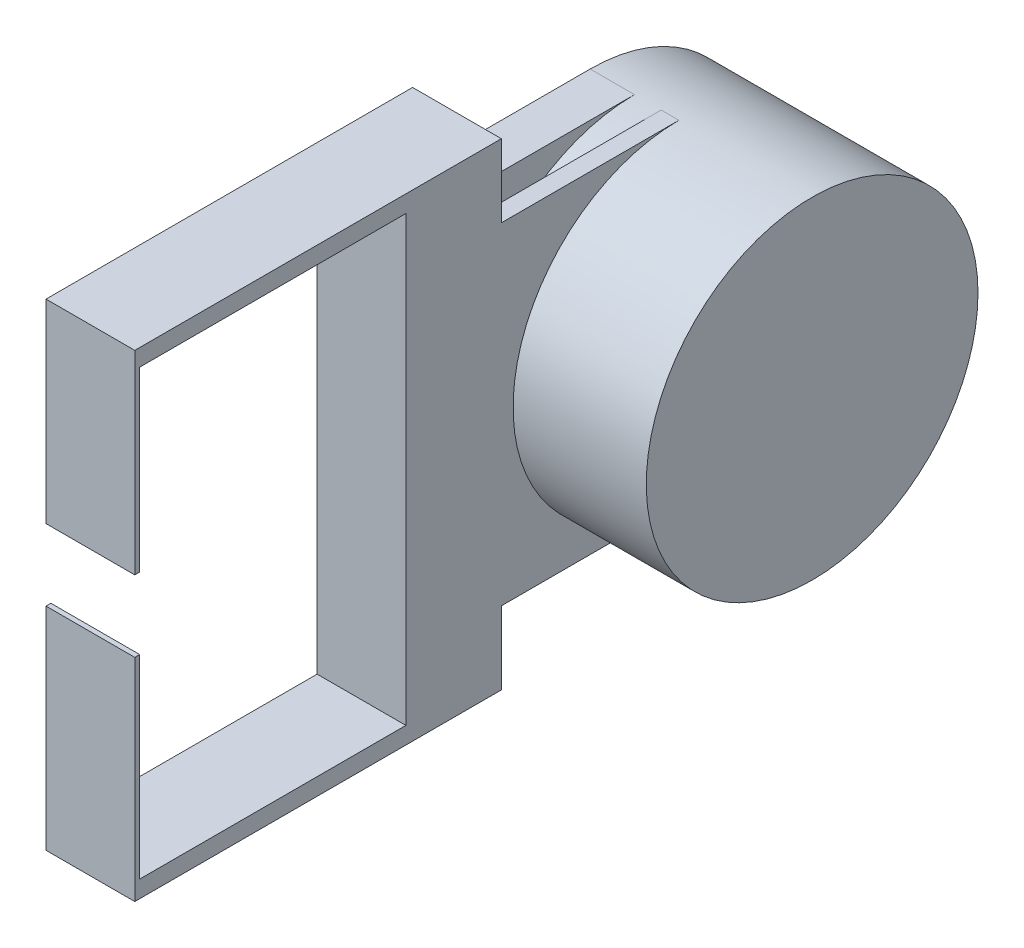
ISO-10303-21;
HEADER;
FILE_DESCRIPTION(('STEP AP214'),'2;1');
FILE_NAME('part.step','',(''),(''),'','','');
FILE_SCHEMA(('AUTOMOTIVE_DESIGN { 1 0 10303 214 1 1 1 1 }'));
ENDSEC;
DATA;
#1=APPLICATION_CONTEXT('core data for automotive mechanical design processes');
#2=APPLICATION_PROTOCOL_DEFINITION('international standard','automotive_design',2000,#1);
#3=PRODUCT_CONTEXT('',#1,'mechanical');
#4=PRODUCT('Part','Part','',(#3));
#5=PRODUCT_RELATED_PRODUCT_CATEGORY('part','',(#4));
#6=PRODUCT_DEFINITION_FORMATION('','',#4);
#7=PRODUCT_DEFINITION_CONTEXT('part definition',#1,'design');
#8=PRODUCT_DEFINITION('design','',#6,#7);
#9=PRODUCT_DEFINITION_SHAPE('','',#8);
#10=(LENGTH_UNIT() NAMED_UNIT(*) SI_UNIT(.MILLI.,.METRE.));
#11=(NAMED_UNIT(*) PLANE_ANGLE_UNIT() SI_UNIT($,.RADIAN.));
#12=(NAMED_UNIT(*) SI_UNIT($,.STERADIAN.) SOLID_ANGLE_UNIT());
#13=UNCERTAINTY_MEASURE_WITH_UNIT(LENGTH_MEASURE(1.E-05),#10,'distance_accuracy_value','');
#14=(GEOMETRIC_REPRESENTATION_CONTEXT(3) GLOBAL_UNCERTAINTY_ASSIGNED_CONTEXT((#13)) GLOBAL_UNIT_ASSIGNED_CONTEXT((#10,
#11,#12)) REPRESENTATION_CONTEXT('',''));
#15=CARTESIAN_POINT('',(0.,0.,0.));
#16=DIRECTION('',(0.,0.,1.));
#17=DIRECTION('',(1.,0.,0.));
#18=AXIS2_PLACEMENT_3D('',#15,#16,#17);
#19=CARTESIAN_POINT('',(31.75,0.,0.));
#20=DIRECTION('',(-1.,0.,0.));
#21=DIRECTION('',(0.,0.,1.));
#22=AXIS2_PLACEMENT_3D('',#19,#20,#21);
#23=CYLINDRICAL_SURFACE('',#22,23.72487);
#24=CARTESIAN_POINT('',(6.34999999999999,0.,0.));
#25=DIRECTION('',(-1.,0.,0.));
#26=DIRECTION('',(0.,-1.,0.));
#27=AXIS2_PLACEMENT_3D('',#24,#25,#26);
#28=CIRCLE('',#27,23.72487);
#29=CARTESIAN_POINT('',(6.35,-23.72487,0.));
#30=VERTEX_POINT('',#29);
#31=CARTESIAN_POINT('',(6.34999999999999,23.72487,0.));
#32=VERTEX_POINT('',#31);
#33=EDGE_CURVE('E55',#30,#32,#28,.T.);
#34=ORIENTED_EDGE('',*,*,#33,.F.);
#35=DIRECTION('',(1.,0.,0.));
#36=VECTOR('',#35,1.);
#37=CARTESIAN_POINT('',(6.35,-23.72487,0.));
#38=LINE('',#37,#36);
#39=CARTESIAN_POINT('',(0.,-23.72487,0.));
#40=VERTEX_POINT('',#39);
#41=EDGE_CURVE('E223',#40,#30,#38,.T.);
#42=ORIENTED_EDGE('',*,*,#41,.F.);
#43=CARTESIAN_POINT('',(0.,0.,0.));
#44=DIRECTION('',(1.,0.,0.));
#45=DIRECTION('',(0.,0.,-1.));
#46=AXIS2_PLACEMENT_3D('',#43,#44,#45);
#47=CIRCLE('',#46,23.72487);
#48=CARTESIAN_POINT('',(0.,23.72487,0.));
#49=VERTEX_POINT('',#48);
#50=EDGE_CURVE('E250',#40,#49,#47,.T.);
#51=ORIENTED_EDGE('',*,*,#50,.T.);
#52=DIRECTION('',(-1.,0.,0.));
#53=VECTOR('',#52,1.);
#54=CARTESIAN_POINT('',(0.,23.72487,0.));
#55=LINE('',#54,#53);
#56=EDGE_CURVE('E230',#32,#49,#55,.T.);
#57=ORIENTED_EDGE('',*,*,#56,.F.);
#58=EDGE_LOOP('',(#34,#42,#51,#57));
#59=FACE_BOUND('',#58,.T.);
#60=CARTESIAN_POINT('',(31.75,0.,0.));
#61=DIRECTION('',(1.,0.,0.));
#62=DIRECTION('',(0.,0.,-1.));
#63=AXIS2_PLACEMENT_3D('',#60,#61,#62);
#64=CIRCLE('',#63,23.72487);
#65=CARTESIAN_POINT('',(31.75,0.,-23.72487));
#66=VERTEX_POINT('',#65);
#67=EDGE_CURVE('E247',#66,#66,#64,.T.);
#68=ORIENTED_EDGE('',*,*,#67,.F.);
#69=EDGE_LOOP('',(#68));
#70=FACE_BOUND('',#69,.T.);
#71=CARTESIAN_POINT('',(10.16,0.,0.));
#72=DIRECTION('',(1.,0.,0.));
#73=DIRECTION('',(0.,1.,0.));
#74=AXIS2_PLACEMENT_3D('',#71,#72,#73);
#75=CIRCLE('',#74,23.72487);
#76=CARTESIAN_POINT('',(10.16,23.72487,0.));
#77=VERTEX_POINT('',#76);
#78=CARTESIAN_POINT('',(10.16,-23.72487,0.));
#79=VERTEX_POINT('',#78);
#80=EDGE_CURVE('E56',#77,#79,#75,.T.);
#81=ORIENTED_EDGE('',*,*,#80,.F.);
#82=DIRECTION('',(-1.,0.,0.));
#83=VECTOR('',#82,1.);
#84=CARTESIAN_POINT('',(10.16,23.72487,0.));
#85=LINE('',#84,#83);
#86=CARTESIAN_POINT('',(12.7,23.72487,0.));
#87=VERTEX_POINT('',#86);
#88=EDGE_CURVE('E63',#87,#77,#85,.T.);
#89=ORIENTED_EDGE('',*,*,#88,.F.);
#90=CARTESIAN_POINT('',(12.7,0.,0.));
#91=DIRECTION('',(-1.,0.,0.));
#92=DIRECTION('',(0.,-1.,0.));
#93=AXIS2_PLACEMENT_3D('',#90,#91,#92);
#94=CIRCLE('',#93,23.72487);
#95=CARTESIAN_POINT('',(12.7,-23.72487,0.));
#96=VERTEX_POINT('',#95);
#97=EDGE_CURVE('E11',#96,#87,#94,.T.);
#98=ORIENTED_EDGE('',*,*,#97,.F.);
#99=DIRECTION('',(1.,0.,0.));
#100=VECTOR('',#99,1.);
#101=CARTESIAN_POINT('',(12.7,-23.72487,0.));
#102=LINE('',#101,#100);
#103=EDGE_CURVE('E184',#79,#96,#102,.T.);
#104=ORIENTED_EDGE('',*,*,#103,.F.);
#105=EDGE_LOOP('',(#81,#89,#98,#104));
#106=FACE_BOUND('',#105,.T.);
#107=ADVANCED_FACE('F44',(#59,#70,#106),#23,.T.);
#108=CARTESIAN_POINT('',(0.,0.,39.05758));
#109=DIRECTION('',(0.,0.,-1.));
#110=DIRECTION('',(-1.,0.,0.));
#111=AXIS2_PLACEMENT_3D('',#108,#109,#110);
#112=PLANE('',#111);
#113=DIRECTION('',(1.,0.,0.));
#114=VECTOR('',#113,1.);
#115=CARTESIAN_POINT('',(12.7,31.70555,39.05758));
#116=LINE('',#115,#114);
#117=CARTESIAN_POINT('',(0.,31.70555,39.05758));
#118=VERTEX_POINT('',#117);
#119=CARTESIAN_POINT('',(12.7,31.70555,39.05758));
#120=VERTEX_POINT('',#119);
#121=EDGE_CURVE('E281',#118,#120,#116,.T.);
#122=ORIENTED_EDGE('',*,*,#121,.F.);
#123=DIRECTION('',(0.,-1.,0.));
#124=VECTOR('',#123,1.);
#125=CARTESIAN_POINT('',(0.,-34.14141,39.05758));
#126=LINE('',#125,#124);
#127=CARTESIAN_POINT('',(0.,-31.70555,39.05758));
#128=VERTEX_POINT('',#127);
#129=EDGE_CURVE('E210',#118,#128,#126,.T.);
#130=ORIENTED_EDGE('',*,*,#129,.T.);
#131=DIRECTION('',(-1.,0.,0.));
#132=VECTOR('',#131,1.);
#133=CARTESIAN_POINT('',(12.7,-31.70555,39.05758));
#134=LINE('',#133,#132);
#135=CARTESIAN_POINT('',(12.7,-31.70555,39.05758));
#136=VERTEX_POINT('',#135);
#137=EDGE_CURVE('E280',#136,#128,#134,.T.);
#138=ORIENTED_EDGE('',*,*,#137,.F.);
#139=DIRECTION('',(0.,1.,0.));
#140=VECTOR('',#139,1.);
#141=CARTESIAN_POINT('',(12.7,34.14141,39.05758));
#142=LINE('',#141,#140);
#143=EDGE_CURVE('E219',#136,#120,#142,.T.);
#144=ORIENTED_EDGE('',*,*,#143,.T.);
#145=EDGE_LOOP('',(#122,#130,#138,#144));
#146=FACE_BOUND('',#145,.T.);
#147=ADVANCED_FACE('F364',(#146),#112,.F.);
#148=CARTESIAN_POINT('',(31.75,0.,0.));
#149=DIRECTION('',(1.,0.,0.));
#150=DIRECTION('',(0.,0.,-1.));
#151=AXIS2_PLACEMENT_3D('',#148,#149,#150);
#152=PLANE('',#151);
#153=ORIENTED_EDGE('',*,*,#67,.T.);
#154=EDGE_LOOP('',(#153));
#155=FACE_BOUND('',#154,.T.);
#156=ADVANCED_FACE('F369',(#155),#152,.T.);
#157=CARTESIAN_POINT('',(0.,0.,0.));
#158=DIRECTION('',(1.,0.,0.));
#159=DIRECTION('',(0.,0.,-1.));
#160=AXIS2_PLACEMENT_3D('',#157,#158,#159);
#161=PLANE('',#160);
#162=ORIENTED_EDGE('',*,*,#50,.F.);
#163=DIRECTION('',(0.,0.,-1.));
#164=VECTOR('',#163,1.);
#165=CARTESIAN_POINT('',(0.,-23.72487,25.4));
#166=LINE('',#165,#164);
#167=CARTESIAN_POINT('',(0.,-23.72487,25.4));
#168=VERTEX_POINT('',#167);
#169=EDGE_CURVE('E232',#168,#40,#166,.T.);
#170=ORIENTED_EDGE('',*,*,#169,.F.);
#171=DIRECTION('',(0.,-1.,0.));
#172=VECTOR('',#171,1.);
#173=CARTESIAN_POINT('',(0.,-34.14141,25.4));
#174=LINE('',#173,#172);
#175=CARTESIAN_POINT('',(0.,-34.14141,25.4));
#176=VERTEX_POINT('',#175);
#177=EDGE_CURVE('E275',#168,#176,#174,.T.);
#178=ORIENTED_EDGE('',*,*,#177,.T.);
#179=DIRECTION('',(0.,0.,-1.));
#180=VECTOR('',#179,1.);
#181=CARTESIAN_POINT('',(0.,-34.14141,39.05758));
#182=LINE('',#181,#180);
#183=CARTESIAN_POINT('',(0.,-34.14141,77.83576));
#184=VERTEX_POINT('',#183);
#185=EDGE_CURVE('E224',#184,#176,#182,.T.);
#186=ORIENTED_EDGE('',*,*,#185,.F.);
#187=DIRECTION('',(0.,-1.,0.));
#188=VECTOR('',#187,1.);
#189=CARTESIAN_POINT('',(0.,-34.14141,77.83576));
#190=LINE('',#189,#188);
#191=CARTESIAN_POINT('',(0.,-3.89001,77.83576));
#192=VERTEX_POINT('',#191);
#193=EDGE_CURVE('E307',#192,#184,#190,.T.);
#194=ORIENTED_EDGE('',*,*,#193,.F.);
#195=DIRECTION('',(0.,0.,-1.));
#196=VECTOR('',#195,1.);
#197=CARTESIAN_POINT('',(0.,-3.89001,77.83576));
#198=LINE('',#197,#196);
#199=CARTESIAN_POINT('',(0.,-3.89001,77.13218));
#200=VERTEX_POINT('',#199);
#201=EDGE_CURVE('E315',#192,#200,#198,.T.);
#202=ORIENTED_EDGE('',*,*,#201,.T.);
#203=DIRECTION('',(0.,-1.,0.));
#204=VECTOR('',#203,1.);
#205=CARTESIAN_POINT('',(0.,-34.14141,77.13218));
#206=LINE('',#205,#204);
#207=CARTESIAN_POINT('',(0.,-31.70555,77.13218));
#208=VERTEX_POINT('',#207);
#209=EDGE_CURVE('E302',#200,#208,#206,.T.);
#210=ORIENTED_EDGE('',*,*,#209,.T.);
#211=DIRECTION('',(0.,0.,-1.));
#212=VECTOR('',#211,1.);
#213=CARTESIAN_POINT('',(0.,-31.70555,77.13218));
#214=LINE('',#213,#212);
#215=EDGE_CURVE('E282',#208,#128,#214,.T.);
#216=ORIENTED_EDGE('',*,*,#215,.T.);
#217=ORIENTED_EDGE('',*,*,#129,.F.);
#218=DIRECTION('',(0.,0.,-1.));
#219=VECTOR('',#218,1.);
#220=CARTESIAN_POINT('',(0.,31.70555,77.13218));
#221=LINE('',#220,#219);
#222=CARTESIAN_POINT('',(0.,31.70555,77.13218));
#223=VERTEX_POINT('',#222);
#224=EDGE_CURVE('E271',#223,#118,#221,.T.);
#225=ORIENTED_EDGE('',*,*,#224,.F.);
#226=DIRECTION('',(0.,-1.,0.));
#227=VECTOR('',#226,1.);
#228=CARTESIAN_POINT('',(0.,34.14141,77.13218));
#229=LINE('',#228,#227);
#230=CARTESIAN_POINT('',(0.,6.32587,77.13218));
#231=VERTEX_POINT('',#230);
#232=EDGE_CURVE('E314',#223,#231,#229,.T.);
#233=ORIENTED_EDGE('',*,*,#232,.T.);
#234=DIRECTION('',(0.,0.,-1.));
#235=VECTOR('',#234,1.);
#236=CARTESIAN_POINT('',(0.,6.32587,77.83576));
#237=LINE('',#236,#235);
#238=CARTESIAN_POINT('',(0.,6.32587,77.83576));
#239=VERTEX_POINT('',#238);
#240=EDGE_CURVE('E287',#239,#231,#237,.T.);
#241=ORIENTED_EDGE('',*,*,#240,.F.);
#242=DIRECTION('',(0.,-1.,0.));
#243=VECTOR('',#242,1.);
#244=CARTESIAN_POINT('',(0.,34.14141,77.83576));
#245=LINE('',#244,#243);
#246=CARTESIAN_POINT('',(0.,34.14141,77.83576));
#247=VERTEX_POINT('',#246);
#248=EDGE_CURVE('E342',#247,#239,#245,.T.);
#249=ORIENTED_EDGE('',*,*,#248,.F.);
#250=DIRECTION('',(0.,0.,-1.));
#251=VECTOR('',#250,1.);
#252=CARTESIAN_POINT('',(0.,34.14141,39.05758));
#253=LINE('',#252,#251);
#254=CARTESIAN_POINT('',(0.,34.14141,25.4));
#255=VERTEX_POINT('',#254);
#256=EDGE_CURVE('E214',#247,#255,#253,.T.);
#257=ORIENTED_EDGE('',*,*,#256,.T.);
#258=CARTESIAN_POINT('',(0.,23.72487,25.4));
#259=VERTEX_POINT('',#258);
#260=EDGE_CURVE('E268',#255,#259,#174,.T.);
#261=ORIENTED_EDGE('',*,*,#260,.T.);
#262=DIRECTION('',(0.,0.,-1.));
#263=VECTOR('',#262,1.);
#264=CARTESIAN_POINT('',(0.,23.72487,25.4));
#265=LINE('',#264,#263);
#266=EDGE_CURVE('E239',#259,#49,#265,.T.);
#267=ORIENTED_EDGE('',*,*,#266,.T.);
#268=EDGE_LOOP('',(#162,#170,#178,#186,#194,#202,#210,#216,#217,#225,#233,#241,#249,#257,#261,#267));
#269=FACE_BOUND('',#268,.T.);
#270=ADVANCED_FACE('F266',(#269),#161,.F.);
#271=CARTESIAN_POINT('',(6.35,-23.72487,25.4));
#272=DIRECTION('',(0.,1.,0.));
#273=DIRECTION('',(0.,0.,1.));
#274=AXIS2_PLACEMENT_3D('',#271,#272,#273);
#275=PLANE('',#274);
#276=ORIENTED_EDGE('',*,*,#41,.T.);
#277=DIRECTION('',(0.,0.,-1.));
#278=VECTOR('',#277,1.);
#279=CARTESIAN_POINT('',(6.35,-23.72487,25.4));
#280=LINE('',#279,#278);
#281=CARTESIAN_POINT('',(6.35,-23.72487,25.4));
#282=VERTEX_POINT('',#281);
#283=EDGE_CURVE('E244',#282,#30,#280,.T.);
#284=ORIENTED_EDGE('',*,*,#283,.F.);
#285=DIRECTION('',(1.,0.,0.));
#286=VECTOR('',#285,1.);
#287=CARTESIAN_POINT('',(6.35,-23.72487,25.4));
#288=LINE('',#287,#286);
#289=EDGE_CURVE('E222',#168,#282,#288,.T.);
#290=ORIENTED_EDGE('',*,*,#289,.F.);
#291=ORIENTED_EDGE('',*,*,#169,.T.);
#292=EDGE_LOOP('',(#276,#284,#290,#291));
#293=FACE_BOUND('',#292,.T.);
#294=ADVANCED_FACE('F400',(#293),#275,.F.);
#295=CARTESIAN_POINT('',(6.34999999999999,23.72487,25.4));
#296=DIRECTION('',(-1.,0.,0.));
#297=DIRECTION('',(0.,-1.,0.));
#298=AXIS2_PLACEMENT_3D('',#295,#296,#297);
#299=PLANE('',#298);
#300=ORIENTED_EDGE('',*,*,#283,.T.);
#301=ORIENTED_EDGE('',*,*,#33,.T.);
#302=DIRECTION('',(0.,0.,-1.));
#303=VECTOR('',#302,1.);
#304=CARTESIAN_POINT('',(6.34999999999999,23.72487,25.4));
#305=LINE('',#304,#303);
#306=CARTESIAN_POINT('',(6.34999999999999,23.72487,25.4));
#307=VERTEX_POINT('',#306);
#308=EDGE_CURVE('E243',#307,#32,#305,.T.);
#309=ORIENTED_EDGE('',*,*,#308,.F.);
#310=DIRECTION('',(0.,1.,0.));
#311=VECTOR('',#310,1.);
#312=CARTESIAN_POINT('',(6.34999999999999,23.72487,25.4));
#313=LINE('',#312,#311);
#314=EDGE_CURVE('E226',#282,#307,#313,.T.);
#315=ORIENTED_EDGE('',*,*,#314,.F.);
#316=EDGE_LOOP('',(#300,#301,#309,#315));
#317=FACE_BOUND('',#316,.T.);
#318=ADVANCED_FACE('F256',(#317),#299,.F.);
#319=CARTESIAN_POINT('',(0.,23.72487,25.4));
#320=DIRECTION('',(0.,-1.,0.));
#321=DIRECTION('',(0.,0.,-1.));
#322=AXIS2_PLACEMENT_3D('',#319,#320,#321);
#323=PLANE('',#322);
#324=ORIENTED_EDGE('',*,*,#56,.T.);
#325=ORIENTED_EDGE('',*,*,#266,.F.);
#326=DIRECTION('',(-1.,0.,0.));
#327=VECTOR('',#326,1.);
#328=CARTESIAN_POINT('',(0.,23.72487,25.4));
#329=LINE('',#328,#327);
#330=EDGE_CURVE('E235',#307,#259,#329,.T.);
#331=ORIENTED_EDGE('',*,*,#330,.F.);
#332=ORIENTED_EDGE('',*,*,#308,.T.);
#333=EDGE_LOOP('',(#324,#325,#331,#332));
#334=FACE_BOUND('',#333,.T.);
#335=ADVANCED_FACE('F261',(#334),#323,.F.);
#336=CARTESIAN_POINT('',(0.,-34.14141,39.05758));
#337=DIRECTION('',(0.,1.,0.));
#338=DIRECTION('',(0.,0.,1.));
#339=AXIS2_PLACEMENT_3D('',#336,#337,#338);
#340=PLANE('',#339);
#341=DIRECTION('',(1.,0.,0.));
#342=VECTOR('',#341,1.);
#343=CARTESIAN_POINT('',(0.,-34.14141,25.4));
#344=LINE('',#343,#342);
#345=CARTESIAN_POINT('',(12.7,-34.14141,25.4));
#346=VERTEX_POINT('',#345);
#347=EDGE_CURVE('E209',#176,#346,#344,.T.);
#348=ORIENTED_EDGE('',*,*,#347,.T.);
#349=DIRECTION('',(0.,0.,-1.));
#350=VECTOR('',#349,1.);
#351=CARTESIAN_POINT('',(12.7,-34.14141,39.05758));
#352=LINE('',#351,#350);
#353=CARTESIAN_POINT('',(12.7,-34.14141,77.83576));
#354=VERTEX_POINT('',#353);
#355=EDGE_CURVE('E205',#354,#346,#352,.T.);
#356=ORIENTED_EDGE('',*,*,#355,.F.);
#357=DIRECTION('',(1.,0.,0.));
#358=VECTOR('',#357,1.);
#359=CARTESIAN_POINT('',(12.7,-34.14141,77.83576));
#360=LINE('',#359,#358);
#361=EDGE_CURVE('E301',#184,#354,#360,.T.);
#362=ORIENTED_EDGE('',*,*,#361,.F.);
#363=ORIENTED_EDGE('',*,*,#185,.T.);
#364=EDGE_LOOP('',(#348,#356,#362,#363));
#365=FACE_BOUND('',#364,.T.);
#366=ADVANCED_FACE('F392',(#365),#340,.F.);
#367=CARTESIAN_POINT('',(12.7,34.14141,39.05758));
#368=DIRECTION('',(-1.,0.,0.));
#369=DIRECTION('',(0.,-1.,0.));
#370=AXIS2_PLACEMENT_3D('',#367,#368,#369);
#371=PLANE('',#370);
#372=DIRECTION('',(0.,1.,0.));
#373=VECTOR('',#372,1.);
#374=CARTESIAN_POINT('',(12.7,34.14141,25.4));
#375=LINE('',#374,#373);
#376=CARTESIAN_POINT('',(12.7,-23.72487,25.4));
#377=VERTEX_POINT('',#376);
#378=EDGE_CURVE('E197',#346,#377,#375,.T.);
#379=ORIENTED_EDGE('',*,*,#378,.T.);
#380=DIRECTION('',(0.,0.,1.));
#381=VECTOR('',#380,1.);
#382=CARTESIAN_POINT('',(12.7,-23.72487,-47.5176748806968));
#383=LINE('',#382,#381);
#384=EDGE_CURVE('E177',#96,#377,#383,.T.);
#385=ORIENTED_EDGE('',*,*,#384,.F.);
#386=ORIENTED_EDGE('',*,*,#97,.T.);
#387=DIRECTION('',(0.,0.,1.));
#388=VECTOR('',#387,1.);
#389=CARTESIAN_POINT('',(12.7,23.72487,-47.5176748806968));
#390=LINE('',#389,#388);
#391=CARTESIAN_POINT('',(12.7,23.72487,25.4));
#392=VERTEX_POINT('',#391);
#393=EDGE_CURVE('E354',#87,#392,#390,.T.);
#394=ORIENTED_EDGE('',*,*,#393,.T.);
#395=CARTESIAN_POINT('',(12.7,34.14141,25.4));
#396=VERTEX_POINT('',#395);
#397=EDGE_CURVE('E202',#392,#396,#375,.T.);
#398=ORIENTED_EDGE('',*,*,#397,.T.);
#399=DIRECTION('',(0.,0.,-1.));
#400=VECTOR('',#399,1.);
#401=CARTESIAN_POINT('',(12.7,34.14141,39.05758));
#402=LINE('',#401,#400);
#403=CARTESIAN_POINT('',(12.7,34.14141,77.83576));
#404=VERTEX_POINT('',#403);
#405=EDGE_CURVE('E217',#404,#396,#402,.T.);
#406=ORIENTED_EDGE('',*,*,#405,.F.);
#407=DIRECTION('',(0.,1.,0.));
#408=VECTOR('',#407,1.);
#409=CARTESIAN_POINT('',(12.7,6.32587,77.83576));
#410=LINE('',#409,#408);
#411=CARTESIAN_POINT('',(12.7,6.32587,77.83576));
#412=VERTEX_POINT('',#411);
#413=EDGE_CURVE('E328',#412,#404,#410,.T.);
#414=ORIENTED_EDGE('',*,*,#413,.F.);
#415=DIRECTION('',(0.,0.,-1.));
#416=VECTOR('',#415,1.);
#417=CARTESIAN_POINT('',(12.7,6.32587,77.83576));
#418=LINE('',#417,#416);
#419=CARTESIAN_POINT('',(12.7,6.32587,77.13218));
#420=VERTEX_POINT('',#419);
#421=EDGE_CURVE('E329',#412,#420,#418,.T.);
#422=ORIENTED_EDGE('',*,*,#421,.T.);
#423=DIRECTION('',(0.,1.,0.));
#424=VECTOR('',#423,1.);
#425=CARTESIAN_POINT('',(12.7,6.32587,77.13218));
#426=LINE('',#425,#424);
#427=CARTESIAN_POINT('',(12.7,31.70555,77.13218));
#428=VERTEX_POINT('',#427);
#429=EDGE_CURVE('E334',#420,#428,#426,.T.);
#430=ORIENTED_EDGE('',*,*,#429,.T.);
#431=DIRECTION('',(0.,0.,-1.));
#432=VECTOR('',#431,1.);
#433=CARTESIAN_POINT('',(12.7,31.70555,77.13218));
#434=LINE('',#433,#432);
#435=EDGE_CURVE('E291',#428,#120,#434,.T.);
#436=ORIENTED_EDGE('',*,*,#435,.T.);
#437=ORIENTED_EDGE('',*,*,#143,.F.);
#438=DIRECTION('',(0.,0.,-1.));
#439=VECTOR('',#438,1.);
#440=CARTESIAN_POINT('',(12.7,-31.70555,77.13218));
#441=LINE('',#440,#439);
#442=CARTESIAN_POINT('',(12.7,-31.70555,77.13218));
#443=VERTEX_POINT('',#442);
#444=EDGE_CURVE('E286',#443,#136,#441,.T.);
#445=ORIENTED_EDGE('',*,*,#444,.F.);
#446=DIRECTION('',(0.,1.,0.));
#447=VECTOR('',#446,1.);
#448=CARTESIAN_POINT('',(12.7,-3.89001,77.13218));
#449=LINE('',#448,#447);
#450=CARTESIAN_POINT('',(12.7,-3.89001,77.13218));
#451=VERTEX_POINT('',#450);
#452=EDGE_CURVE('E312',#443,#451,#449,.T.);
#453=ORIENTED_EDGE('',*,*,#452,.T.);
#454=DIRECTION('',(0.,0.,-1.));
#455=VECTOR('',#454,1.);
#456=CARTESIAN_POINT('',(12.7,-3.89001,77.83576));
#457=LINE('',#456,#455);
#458=CARTESIAN_POINT('',(12.7,-3.89001,77.83576));
#459=VERTEX_POINT('',#458);
#460=EDGE_CURVE('E322',#459,#451,#457,.T.);
#461=ORIENTED_EDGE('',*,*,#460,.F.);
#462=DIRECTION('',(0.,1.,0.));
#463=VECTOR('',#462,1.);
#464=CARTESIAN_POINT('',(12.7,-3.89001,77.83576));
#465=LINE('',#464,#463);
#466=EDGE_CURVE('E304',#354,#459,#465,.T.);
#467=ORIENTED_EDGE('',*,*,#466,.F.);
#468=ORIENTED_EDGE('',*,*,#355,.T.);
#469=EDGE_LOOP('',(#379,#385,#386,#394,#398,#406,#414,#422,#430,#436,#437,#445,#453,#461,#467,#468));
#470=FACE_BOUND('',#469,.T.);
#471=ADVANCED_FACE('F204',(#470),#371,.F.);
#472=CARTESIAN_POINT('',(0.,34.14141,39.05758));
#473=DIRECTION('',(0.,-1.,0.));
#474=DIRECTION('',(0.,0.,-1.));
#475=AXIS2_PLACEMENT_3D('',#472,#473,#474);
#476=PLANE('',#475);
#477=DIRECTION('',(-1.,0.,0.));
#478=VECTOR('',#477,1.);
#479=CARTESIAN_POINT('',(0.,34.14141,25.4));
#480=LINE('',#479,#478);
#481=EDGE_CURVE('E203',#396,#255,#480,.T.);
#482=ORIENTED_EDGE('',*,*,#481,.T.);
#483=ORIENTED_EDGE('',*,*,#256,.F.);
#484=DIRECTION('',(-1.,0.,0.));
#485=VECTOR('',#484,1.);
#486=CARTESIAN_POINT('',(12.7,34.14141,77.83576));
#487=LINE('',#486,#485);
#488=EDGE_CURVE('E333',#404,#247,#487,.T.);
#489=ORIENTED_EDGE('',*,*,#488,.F.);
#490=ORIENTED_EDGE('',*,*,#405,.T.);
#491=EDGE_LOOP('',(#482,#483,#489,#490));
#492=FACE_BOUND('',#491,.T.);
#493=ADVANCED_FACE('F386',(#492),#476,.F.);
#494=CARTESIAN_POINT('',(0.,0.,25.4));
#495=DIRECTION('',(0.,0.,-1.));
#496=DIRECTION('',(-1.,0.,0.));
#497=AXIS2_PLACEMENT_3D('',#494,#495,#496);
#498=PLANE('',#497);
#499=DIRECTION('',(1.,0.,0.));
#500=VECTOR('',#499,1.);
#501=CARTESIAN_POINT('',(10.16,23.72487,25.4));
#502=LINE('',#501,#500);
#503=CARTESIAN_POINT('',(10.16,23.72487,25.4));
#504=VERTEX_POINT('',#503);
#505=EDGE_CURVE('E355',#504,#392,#502,.T.);
#506=ORIENTED_EDGE('',*,*,#505,.F.);
#507=DIRECTION('',(0.,1.,0.));
#508=VECTOR('',#507,1.);
#509=CARTESIAN_POINT('',(10.16,-23.72487,25.4));
#510=LINE('',#509,#508);
#511=CARTESIAN_POINT('',(10.16,-23.72487,25.4));
#512=VERTEX_POINT('',#511);
#513=EDGE_CURVE('E200',#512,#504,#510,.T.);
#514=ORIENTED_EDGE('',*,*,#513,.F.);
#515=DIRECTION('',(-1.,0.,0.));
#516=VECTOR('',#515,1.);
#517=CARTESIAN_POINT('',(12.7,-23.72487,25.4));
#518=LINE('',#517,#516);
#519=EDGE_CURVE('E182',#377,#512,#518,.T.);
#520=ORIENTED_EDGE('',*,*,#519,.F.);
#521=ORIENTED_EDGE('',*,*,#378,.F.);
#522=ORIENTED_EDGE('',*,*,#347,.F.);
#523=ORIENTED_EDGE('',*,*,#177,.F.);
#524=ORIENTED_EDGE('',*,*,#289,.T.);
#525=ORIENTED_EDGE('',*,*,#314,.T.);
#526=ORIENTED_EDGE('',*,*,#330,.T.);
#527=ORIENTED_EDGE('',*,*,#260,.F.);
#528=ORIENTED_EDGE('',*,*,#481,.F.);
#529=ORIENTED_EDGE('',*,*,#397,.F.);
#530=EDGE_LOOP('',(#506,#514,#520,#521,#522,#523,#524,#525,#526,#527,#528,#529));
#531=FACE_BOUND('',#530,.T.);
#532=ADVANCED_FACE('F193',(#531),#498,.T.);
#533=CARTESIAN_POINT('',(12.7,-31.70555,77.13218));
#534=DIRECTION('',(0.,-1.,0.));
#535=DIRECTION('',(0.,0.,-1.));
#536=AXIS2_PLACEMENT_3D('',#533,#534,#535);
#537=PLANE('',#536);
#538=ORIENTED_EDGE('',*,*,#137,.T.);
#539=ORIENTED_EDGE('',*,*,#215,.F.);
#540=DIRECTION('',(-1.,0.,0.));
#541=VECTOR('',#540,1.);
#542=CARTESIAN_POINT('',(12.7,-31.70555,77.13218));
#543=LINE('',#542,#541);
#544=EDGE_CURVE('E277',#443,#208,#543,.T.);
#545=ORIENTED_EDGE('',*,*,#544,.F.);
#546=ORIENTED_EDGE('',*,*,#444,.T.);
#547=EDGE_LOOP('',(#538,#539,#545,#546));
#548=FACE_BOUND('',#547,.T.);
#549=ADVANCED_FACE('F385',(#548),#537,.F.);
#550=CARTESIAN_POINT('',(12.7,31.70555,77.13218));
#551=DIRECTION('',(0.,1.,0.));
#552=DIRECTION('',(0.,0.,1.));
#553=AXIS2_PLACEMENT_3D('',#550,#551,#552);
#554=PLANE('',#553);
#555=ORIENTED_EDGE('',*,*,#121,.T.);
#556=ORIENTED_EDGE('',*,*,#435,.F.);
#557=DIRECTION('',(1.,0.,0.));
#558=VECTOR('',#557,1.);
#559=CARTESIAN_POINT('',(12.7,31.70555,77.13218));
#560=LINE('',#559,#558);
#561=EDGE_CURVE('E298',#223,#428,#560,.T.);
#562=ORIENTED_EDGE('',*,*,#561,.F.);
#563=ORIENTED_EDGE('',*,*,#224,.T.);
#564=EDGE_LOOP('',(#555,#556,#562,#563));
#565=FACE_BOUND('',#564,.T.);
#566=ADVANCED_FACE('F421',(#565),#554,.F.);
#567=CARTESIAN_POINT('',(0.,0.,77.13218));
#568=DIRECTION('',(0.,0.,1.));
#569=DIRECTION('',(1.,0.,0.));
#570=AXIS2_PLACEMENT_3D('',#567,#568,#569);
#571=PLANE('',#570);
#572=ORIENTED_EDGE('',*,*,#232,.F.);
#573=ORIENTED_EDGE('',*,*,#561,.T.);
#574=ORIENTED_EDGE('',*,*,#429,.F.);
#575=DIRECTION('',(1.,0.,0.));
#576=VECTOR('',#575,1.);
#577=CARTESIAN_POINT('',(0.,6.32587,77.13218));
#578=LINE('',#577,#576);
#579=EDGE_CURVE('E332',#231,#420,#578,.T.);
#580=ORIENTED_EDGE('',*,*,#579,.F.);
#581=EDGE_LOOP('',(#572,#573,#574,#580));
#582=FACE_BOUND('',#581,.T.);
#583=ADVANCED_FACE('F431',(#582),#571,.F.);
#584=CARTESIAN_POINT('',(0.,6.32587,77.83576));
#585=DIRECTION('',(0.,1.,0.));
#586=DIRECTION('',(0.,0.,1.));
#587=AXIS2_PLACEMENT_3D('',#584,#585,#586);
#588=PLANE('',#587);
#589=ORIENTED_EDGE('',*,*,#579,.T.);
#590=ORIENTED_EDGE('',*,*,#421,.F.);
#591=DIRECTION('',(1.,0.,0.));
#592=VECTOR('',#591,1.);
#593=CARTESIAN_POINT('',(0.,6.32587,77.83576));
#594=LINE('',#593,#592);
#595=EDGE_CURVE('E338',#239,#412,#594,.T.);
#596=ORIENTED_EDGE('',*,*,#595,.F.);
#597=ORIENTED_EDGE('',*,*,#240,.T.);
#598=EDGE_LOOP('',(#589,#590,#596,#597));
#599=FACE_BOUND('',#598,.T.);
#600=ADVANCED_FACE('F438',(#599),#588,.F.);
#601=CARTESIAN_POINT('',(0.,0.,77.83576));
#602=DIRECTION('',(0.,0.,1.));
#603=DIRECTION('',(1.,0.,0.));
#604=AXIS2_PLACEMENT_3D('',#601,#602,#603);
#605=PLANE('',#604);
#606=ORIENTED_EDGE('',*,*,#488,.T.);
#607=ORIENTED_EDGE('',*,*,#248,.T.);
#608=ORIENTED_EDGE('',*,*,#595,.T.);
#609=ORIENTED_EDGE('',*,*,#413,.T.);
#610=EDGE_LOOP('',(#606,#607,#608,#609));
#611=FACE_BOUND('',#610,.T.);
#612=ADVANCED_FACE('F450',(#611),#605,.T.);
#613=CARTESIAN_POINT('',(0.,-3.89001,77.83576));
#614=DIRECTION('',(0.,-1.,0.));
#615=DIRECTION('',(0.,0.,-1.));
#616=AXIS2_PLACEMENT_3D('',#613,#614,#615);
#617=PLANE('',#616);
#618=DIRECTION('',(-1.,0.,0.));
#619=VECTOR('',#618,1.);
#620=CARTESIAN_POINT('',(0.,-3.89001,77.13218));
#621=LINE('',#620,#619);
#622=EDGE_CURVE('E317',#451,#200,#621,.T.);
#623=ORIENTED_EDGE('',*,*,#622,.T.);
#624=ORIENTED_EDGE('',*,*,#201,.F.);
#625=DIRECTION('',(-1.,0.,0.));
#626=VECTOR('',#625,1.);
#627=CARTESIAN_POINT('',(0.,-3.89001,77.83576));
#628=LINE('',#627,#626);
#629=EDGE_CURVE('E310',#459,#192,#628,.T.);
#630=ORIENTED_EDGE('',*,*,#629,.F.);
#631=ORIENTED_EDGE('',*,*,#460,.T.);
#632=EDGE_LOOP('',(#623,#624,#630,#631));
#633=FACE_BOUND('',#632,.T.);
#634=ADVANCED_FACE('F457',(#633),#617,.F.);
#635=CARTESIAN_POINT('',(0.,0.,77.83576));
#636=DIRECTION('',(0.,0.,-1.));
#637=DIRECTION('',(-1.,0.,0.));
#638=AXIS2_PLACEMENT_3D('',#635,#636,#637);
#639=PLANE('',#638);
#640=ORIENTED_EDGE('',*,*,#361,.T.);
#641=ORIENTED_EDGE('',*,*,#466,.T.);
#642=ORIENTED_EDGE('',*,*,#629,.T.);
#643=ORIENTED_EDGE('',*,*,#193,.T.);
#644=EDGE_LOOP('',(#640,#641,#642,#643));
#645=FACE_BOUND('',#644,.T.);
#646=ADVANCED_FACE('F462',(#645),#639,.F.);
#647=CARTESIAN_POINT('',(0.,0.,77.13218));
#648=DIRECTION('',(0.,0.,-1.));
#649=DIRECTION('',(-1.,0.,0.));
#650=AXIS2_PLACEMENT_3D('',#647,#648,#649);
#651=PLANE('',#650);
#652=ORIENTED_EDGE('',*,*,#452,.F.);
#653=ORIENTED_EDGE('',*,*,#544,.T.);
#654=ORIENTED_EDGE('',*,*,#209,.F.);
#655=ORIENTED_EDGE('',*,*,#622,.F.);
#656=EDGE_LOOP('',(#652,#653,#654,#655));
#657=FACE_BOUND('',#656,.T.);
#658=ADVANCED_FACE('F474',(#657),#651,.T.);
#659=CARTESIAN_POINT('',(10.16,-23.72487,-47.5176748806968));
#660=DIRECTION('',(1.,0.,0.));
#661=DIRECTION('',(0.,1.,0.));
#662=AXIS2_PLACEMENT_3D('',#659,#660,#661);
#663=PLANE('',#662);
#664=DIRECTION('',(0.,0.,1.));
#665=VECTOR('',#664,1.);
#666=CARTESIAN_POINT('',(10.16,23.72487,-47.5176748806968));
#667=LINE('',#666,#665);
#668=EDGE_CURVE('E346',#77,#504,#667,.T.);
#669=ORIENTED_EDGE('',*,*,#668,.F.);
#670=ORIENTED_EDGE('',*,*,#80,.T.);
#671=DIRECTION('',(0.,0.,1.));
#672=VECTOR('',#671,1.);
#673=CARTESIAN_POINT('',(10.16,-23.72487,-47.5176748806968));
#674=LINE('',#673,#672);
#675=EDGE_CURVE('E189',#79,#512,#674,.T.);
#676=ORIENTED_EDGE('',*,*,#675,.T.);
#677=ORIENTED_EDGE('',*,*,#513,.T.);
#678=EDGE_LOOP('',(#669,#670,#676,#677));
#679=FACE_BOUND('',#678,.T.);
#680=ADVANCED_FACE('F356',(#679),#663,.F.);
#681=CARTESIAN_POINT('',(10.16,23.72487,-47.5176748806968));
#682=DIRECTION('',(0.,-1.,0.));
#683=DIRECTION('',(0.,0.,-1.));
#684=AXIS2_PLACEMENT_3D('',#681,#682,#683);
#685=PLANE('',#684);
#686=ORIENTED_EDGE('',*,*,#393,.F.);
#687=ORIENTED_EDGE('',*,*,#88,.T.);
#688=ORIENTED_EDGE('',*,*,#668,.T.);
#689=ORIENTED_EDGE('',*,*,#505,.T.);
#690=EDGE_LOOP('',(#686,#687,#688,#689));
#691=FACE_BOUND('',#690,.T.);
#692=ADVANCED_FACE('F365',(#691),#685,.F.);
#693=CARTESIAN_POINT('',(12.7,-23.72487,-47.5176748806968));
#694=DIRECTION('',(0.,1.,0.));
#695=DIRECTION('',(0.,0.,1.));
#696=AXIS2_PLACEMENT_3D('',#693,#694,#695);
#697=PLANE('',#696);
#698=ORIENTED_EDGE('',*,*,#675,.F.);
#699=ORIENTED_EDGE('',*,*,#103,.T.);
#700=ORIENTED_EDGE('',*,*,#384,.T.);
#701=ORIENTED_EDGE('',*,*,#519,.T.);
#702=EDGE_LOOP('',(#698,#699,#700,#701));
#703=FACE_BOUND('',#702,.T.);
#704=ADVANCED_FACE('F185',(#703),#697,.F.);
#705=CLOSED_SHELL('',(#107,#147,#156,#270,#294,#318,#335,#366,#471,#493,#532,#549,#566,#583,
#600,#612,#634,#646,#658,#680,#692,#704));
#706=MANIFOLD_SOLID_BREP('B2',#705);
#707=ADVANCED_BREP_SHAPE_REPRESENTATION('',(#18,#706),#14);
#708=SHAPE_DEFINITION_REPRESENTATION(#9,#707);
ENDSEC;
END-ISO-10303-21;
